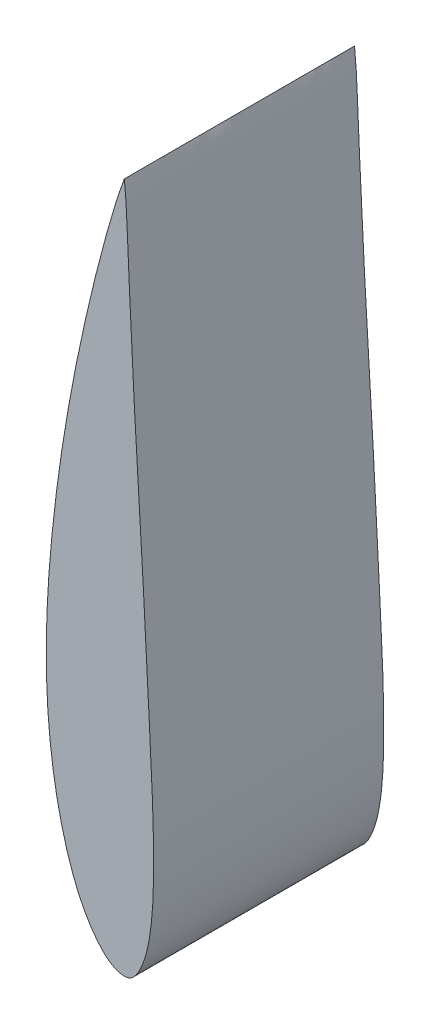
ISO-10303-21;
HEADER;
FILE_DESCRIPTION(('STEP AP214'),'2;1');
FILE_NAME('part.step','',(''),(''),'','','');
FILE_SCHEMA(('AUTOMOTIVE_DESIGN { 1 0 10303 214 1 1 1 1 }'));
ENDSEC;
DATA;
#1=APPLICATION_CONTEXT('core data for automotive mechanical design processes');
#2=APPLICATION_PROTOCOL_DEFINITION('international standard','automotive_design',2000,#1);
#3=PRODUCT_CONTEXT('',#1,'mechanical');
#4=PRODUCT('Part','Part','',(#3));
#5=PRODUCT_RELATED_PRODUCT_CATEGORY('part','',(#4));
#6=PRODUCT_DEFINITION_FORMATION('','',#4);
#7=PRODUCT_DEFINITION_CONTEXT('part definition',#1,'design');
#8=PRODUCT_DEFINITION('design','',#6,#7);
#9=PRODUCT_DEFINITION_SHAPE('','',#8);
#10=(LENGTH_UNIT() NAMED_UNIT(*) SI_UNIT(.MILLI.,.METRE.));
#11=(NAMED_UNIT(*) PLANE_ANGLE_UNIT() SI_UNIT($,.RADIAN.));
#12=(NAMED_UNIT(*) SI_UNIT($,.STERADIAN.) SOLID_ANGLE_UNIT());
#13=UNCERTAINTY_MEASURE_WITH_UNIT(LENGTH_MEASURE(1.E-05),#10,'distance_accuracy_value','');
#14=(GEOMETRIC_REPRESENTATION_CONTEXT(3) GLOBAL_UNCERTAINTY_ASSIGNED_CONTEXT((#13)) GLOBAL_UNIT_ASSIGNED_CONTEXT((#10,
#11,#12)) REPRESENTATION_CONTEXT('',''));
#15=CARTESIAN_POINT('',(0.,0.,0.));
#16=DIRECTION('',(0.,0.,1.));
#17=DIRECTION('',(1.,0.,0.));
#18=AXIS2_PLACEMENT_3D('',#15,#16,#17);
#19=CARTESIAN_POINT('',(15.4663667825706,28.1261565789334,10.));
#20=CARTESIAN_POINT('',(15.4638684441459,28.126783161376,10.));
#21=CARTESIAN_POINT('',(15.4449104835097,28.056380528739,10.));
#22=CARTESIAN_POINT('',(15.4132361228788,27.9869053379319,10.));
#23=CARTESIAN_POINT('',(15.3535076497844,27.8123946326928,10.));
#24=CARTESIAN_POINT('',(15.276656887395,27.5965068689572,10.));
#25=CARTESIAN_POINT('',(15.1798013636871,27.3098248242934,10.));
#26=CARTESIAN_POINT('',(15.0695855777394,26.9653938982621,10.));
#27=CARTESIAN_POINT('',(14.946199643225,26.560433585722,10.));
#28=CARTESIAN_POINT('',(14.8122993513487,26.0981120447139,10.));
#29=CARTESIAN_POINT('',(14.6672927332637,25.5803222969941,10.));
#30=CARTESIAN_POINT('',(14.5122028757606,25.0094076938907,10.));
#31=CARTESIAN_POINT('',(14.3492055748167,24.3875504002957,10.));
#32=CARTESIAN_POINT('',(14.1802364286354,23.7173609394492,10.));
#33=CARTESIAN_POINT('',(14.0072122750729,23.001788509567,10.));
#34=CARTESIAN_POINT('',(13.831126746328,22.2440603500589,10.));
#35=CARTESIAN_POINT('',(13.653483137024,21.4472674881157,10.));
#36=CARTESIAN_POINT('',(13.4761436714645,20.6148114522323,10.));
#37=CARTESIAN_POINT('',(13.3014519360402,19.7502532843641,10.));
#38=CARTESIAN_POINT('',(13.1320910072835,18.8572873539011,10.));
#39=CARTESIAN_POINT('',(12.9690687059906,17.9399020888325,10.));
#40=CARTESIAN_POINT('',(12.8149730888797,17.0018370687674,10.));
#41=CARTESIAN_POINT('',(12.6709210221806,16.0470970432242,10.));
#42=CARTESIAN_POINT('',(12.5385925023225,15.0798469590538,10.));
#43=CARTESIAN_POINT('',(12.4195794601418,14.1041599314178,10.));
#44=CARTESIAN_POINT('',(12.3142372542669,13.1244575194772,10.));
#45=CARTESIAN_POINT('',(12.2252228130272,12.1447047602585,10.));
#46=CARTESIAN_POINT('',(12.1540031226636,11.169046452169,10.));
#47=CARTESIAN_POINT('',(12.1027505288352,10.2017496846331,10.));
#48=CARTESIAN_POINT('',(12.07391949847,9.24688039045705,10.));
#49=CARTESIAN_POINT('',(12.0696314460418,8.30865956392001,10.));
#50=CARTESIAN_POINT('',(12.0898675722181,7.39099241897038,10.));
#51=CARTESIAN_POINT('',(12.1361123412766,6.49780387054982,10.));
#52=CARTESIAN_POINT('',(12.2078304573246,5.63293191508567,10.));
#53=CARTESIAN_POINT('',(12.3038231540884,4.80019076779166,10.));
#54=CARTESIAN_POINT('',(12.4222428024502,4.00314723400594,10.));
#55=CARTESIAN_POINT('',(12.5611743969195,3.24504816059358,10.));
#56=CARTESIAN_POINT('',(12.720678449849,2.52937489258769,10.));
#57=CARTESIAN_POINT('',(12.8969979606794,1.85892032984315,10.));
#58=CARTESIAN_POINT('',(13.0873995095947,1.23623032193105,10.));
#59=CARTESIAN_POINT('',(13.2924820899346,0.663839707621272,10.));
#60=CARTESIAN_POINT('',(13.5145962777507,0.145201492771341,10.));
#61=CARTESIAN_POINT('',(13.7502285166945,-0.317791232952857,10.));
#62=CARTESIAN_POINT('',(13.9948999580407,-0.722358558788239,10.));
#63=CARTESIAN_POINT('',(14.2393122930177,-1.06970969381758,10.));
#64=CARTESIAN_POINT('',(14.4836626029098,-1.35717710638239,10.));
#65=CARTESIAN_POINT('',(14.7285679118952,-1.58656762317428,10.));
#66=CARTESIAN_POINT('',(14.980525239646,-1.74951913248341,10.));
#67=CARTESIAN_POINT('',(15.2275212188089,-1.84689350033204,10.));
#68=CARTESIAN_POINT('',(15.4562135588772,-1.88468261258595,10.));
#69=CARTESIAN_POINT('',(15.6623567957161,-1.85526604765274,10.));
#70=CARTESIAN_POINT('',(15.8352251018268,-1.74610174668397,10.));
#71=CARTESIAN_POINT('',(15.9814071962862,-1.5760168438643,10.));
#72=CARTESIAN_POINT('',(16.1216878299964,-1.35043992293945,10.));
#73=CARTESIAN_POINT('',(16.2511743513379,-1.06244305818338,10.));
#74=CARTESIAN_POINT('',(16.3739456736392,-0.716282449663887,10.));
#75=CARTESIAN_POINT('',(16.4824826632833,-0.310533014423055,10.));
#76=CARTESIAN_POINT('',(16.5705795631837,0.152972685246866,10.));
#77=CARTESIAN_POINT('',(16.6390310000473,0.671569463248005,10.));
#78=CARTESIAN_POINT('',(16.6897680864658,1.24306491215493,10.));
#79=CARTESIAN_POINT('',(16.7226898439998,1.86529194219535,10.));
#80=CARTESIAN_POINT('',(16.7392883331958,2.53565687159472,10.));
#81=CARTESIAN_POINT('',(16.7410673558371,3.25119604126866,10.));
#82=CARTESIAN_POINT('',(16.7312197404145,4.00886684814358,10.));
#83=CARTESIAN_POINT('',(16.7095107605175,4.8055974072795,10.));
#84=CARTESIAN_POINT('',(16.6769565992356,5.63794491301902,10.));
#85=CARTESIAN_POINT('',(16.6371725794661,6.50236821700548,10.));
#86=CARTESIAN_POINT('',(16.5925742603328,7.3950781684484,10.));
#87=CARTESIAN_POINT('',(16.5458464221199,8.31231620396819,10.));
#88=CARTESIAN_POINT('',(16.4981464454011,9.25018564884699,10.));
#89=CARTESIAN_POINT('',(16.4492158269578,10.2047584479837,10.));
#90=CARTESIAN_POINT('',(16.3988386762855,11.1718340743897,10.));
#91=CARTESIAN_POINT('',(16.3465369654988,12.1472975389514,10.));
#92=CARTESIAN_POINT('',(16.2924832004316,13.1268627729053,10.));
#93=CARTESIAN_POINT('',(16.2366026333116,14.1064200102949,10.));
#94=CARTESIAN_POINT('',(16.1790288799891,15.0818521352054,10.));
#95=CARTESIAN_POINT('',(16.1210903795753,16.0489024180898,10.));
#96=CARTESIAN_POINT('',(16.0628590119413,17.0034158526685,10.));
#97=CARTESIAN_POINT('',(16.0060830719895,17.9412284272592,10.));
#98=CARTESIAN_POINT('',(15.9528069565538,18.8585021462133,10.));
#99=CARTESIAN_POINT('',(15.9020685971365,19.7512346116812,10.));
#100=CARTESIAN_POINT('',(15.8556828073345,20.6157167672786,10.));
#101=CARTESIAN_POINT('',(15.8128190484314,21.4480943421943,10.));
#102=CARTESIAN_POINT('',(15.7732662875043,22.2447729157808,10.));
#103=CARTESIAN_POINT('',(15.7368139962213,23.0023562221678,10.));
#104=CARTESIAN_POINT('',(15.7028915917369,23.7177227745752,10.));
#105=CARTESIAN_POINT('',(15.6721054158496,24.3878002824584,10.));
#106=CARTESIAN_POINT('',(15.6443878993426,25.0095846857634,10.));
#107=CARTESIAN_POINT('',(15.6194869296547,25.5804505409505,10.));
#108=CARTESIAN_POINT('',(15.5982599555344,26.0981074842884,10.));
#109=CARTESIAN_POINT('',(15.5780977845238,26.5601358741885,10.));
#110=CARTESIAN_POINT('',(15.5581662630773,26.9650484758902,10.));
#111=CARTESIAN_POINT('',(15.5372333460942,27.3094590215769,10.));
#112=CARTESIAN_POINT('',(15.5159014125044,27.5961842592088,10.));
#113=CARTESIAN_POINT('',(15.4959033626249,27.8127164724872,10.));
#114=CARTESIAN_POINT('',(15.4821943198853,27.9858025111504,10.));
#115=CARTESIAN_POINT('',(15.4701674231533,28.058189593863,10.));
#116=CARTESIAN_POINT('',(15.4687264345746,28.1255647789988,10.));
#117=CARTESIAN_POINT('',(15.4663667825706,28.1261565789334,10.));
#118=B_SPLINE_CURVE_WITH_KNOTS('',3,(#19,#20,#21,#22,#23,#24,#25,#26,#27,#28,#29,#30,#31,#32,
#33,#34,#35,#36,#37,#38,#39,#40,#41,#42,#43,#44,#45,#46,#47,#48,#49,#50,#51,#52,#53,#54,#55,#56,
#57,#58,#59,#60,#61,#62,#63,#64,#65,#66,#67,#68,#69,#70,#71,#72,#73,#74,#75,#76,#77,#78,#79,#80,
#81,#82,#83,#84,#85,#86,#87,#88,#89,#90,#91,#92,#93,#94,#95,#96,#97,#98,#99,#100,#101,#102,#103,
#104,#105,#106,#107,#108,#109,#110,#111,#112,#113,#114,#115,#116,#117),.UNSPECIFIED.,.T.,.F.,(4,
1,1,1,1,1,1,1,1,1,1,1,1,1,1,1,1,1,1,1,1,1,1,1,1,1,1,1,1,1,1,1,1,1,1,1,1,1,1,1,1,1,1,1,1,1,1,1,1,
1,1,1,1,1,1,1,1,1,1,1,1,1,1,1,1,1,1,1,1,1,1,1,1,1,1,1,1,1,1,1,1,1,1,1,1,1,1,1,1,1,1,1,1,1,1,1,
4),(0.,0.000551748168968893,0.00220699267587567,0.00495331783629985,0.00876859672551883,
0.0136237103771036,0.0194917544957016,0.0263313761663127,0.0341182377216171,0.042814763955343,
0.0523803885286978,0.062780118387526,0.0739593343954944,0.085864937864062,0.0984463037826211,
0.111647061015066,0.12541472895254,0.139681018693595,0.154378272357371,0.169446877618796,
0.184821177621069,0.200432900996903,0.216223779700666,0.232116858767118,0.248051215843782,
0.263959620823849,0.27977654948636,0.295442408690199,0.310884918055121,0.326054012337803,
0.340892172022955,0.35534852787555,0.369377925346872,0.382929883149188,0.395952713293497,
0.408409584981713,0.420261404507798,0.431467240770188,0.441987752365542,0.451798802150431,
0.460909689796347,0.469303541319367,0.476945895645793,0.483797690745962,0.489858127722002,
0.495197566311554,0.499996833289608,0.504303705219508,0.507974055932029,0.511122506497602,
0.514149355613405,0.517650443947016,0.52191241533645,0.526982255093721,0.532915788027299,
0.539692296023927,0.547308644858914,0.555757425724944,0.56502508331668,0.575098193409434,
0.585939785327678,0.597509158845338,0.609762380674192,0.622648893896746,0.636121864611897,
0.65011775904116,0.664572179415377,0.679425295742404,0.694613250277113,0.710068303100324,
0.725732642993377,0.741529126657818,0.757394896143958,0.773262272158925,0.789063314563828,
0.804734339670543,0.820197409138394,0.835393047804989,0.85025214178361,0.864711863809534,
0.878713432162598,0.892194296731273,0.905091860230497,0.91735800514861,0.928939747527773,
0.939788482525129,0.949855830913999,0.959093409025121,0.967472191854875,0.974954677217858,
0.981503132690762,0.987099408627994,0.991709920982455,0.995322895771173,0.997916481877858,
0.999478880179029,1.),.UNSPECIFIED.);
#119=DIRECTION('',(0.,0.,-1.));
#120=VECTOR('',#119,1.);
#121=SURFACE_OF_LINEAR_EXTRUSION('',#118,#120);
#122=CARTESIAN_POINT('',(15.4663667825706,28.1261565789334,10.));
#123=VERTEX_POINT('',#122);
#124=EDGE_CURVE('E10',#123,#123,#118,.T.);
#125=ORIENTED_EDGE('',*,*,#124,.F.);
#126=EDGE_LOOP('',(#125));
#127=FACE_BOUND('',#126,.T.);
#128=CARTESIAN_POINT('',(15.4663667825706,28.1261565789334,0.));
#129=CARTESIAN_POINT('',(15.4638684441459,28.126783161376,0.));
#130=CARTESIAN_POINT('',(15.4449104835097,28.056380528739,0.));
#131=CARTESIAN_POINT('',(15.4132361228788,27.9869053379319,0.));
#132=CARTESIAN_POINT('',(15.3535076497844,27.8123946326928,0.));
#133=CARTESIAN_POINT('',(15.276656887395,27.5965068689572,0.));
#134=CARTESIAN_POINT('',(15.1798013636871,27.3098248242934,0.));
#135=CARTESIAN_POINT('',(15.0695855777394,26.9653938982621,0.));
#136=CARTESIAN_POINT('',(14.946199643225,26.560433585722,0.));
#137=CARTESIAN_POINT('',(14.8122993513487,26.0981120447139,0.));
#138=CARTESIAN_POINT('',(14.6672927332637,25.5803222969941,0.));
#139=CARTESIAN_POINT('',(14.5122028757606,25.0094076938907,0.));
#140=CARTESIAN_POINT('',(14.3492055748167,24.3875504002957,0.));
#141=CARTESIAN_POINT('',(14.1802364286354,23.7173609394492,0.));
#142=CARTESIAN_POINT('',(14.0072122750729,23.001788509567,0.));
#143=CARTESIAN_POINT('',(13.831126746328,22.2440603500589,0.));
#144=CARTESIAN_POINT('',(13.653483137024,21.4472674881157,0.));
#145=CARTESIAN_POINT('',(13.4761436714645,20.6148114522323,0.));
#146=CARTESIAN_POINT('',(13.3014519360402,19.7502532843641,0.));
#147=CARTESIAN_POINT('',(13.1320910072835,18.8572873539011,0.));
#148=CARTESIAN_POINT('',(12.9690687059906,17.9399020888325,0.));
#149=CARTESIAN_POINT('',(12.8149730888797,17.0018370687674,0.));
#150=CARTESIAN_POINT('',(12.6709210221806,16.0470970432242,0.));
#151=CARTESIAN_POINT('',(12.5385925023225,15.0798469590538,0.));
#152=CARTESIAN_POINT('',(12.4195794601418,14.1041599314178,0.));
#153=CARTESIAN_POINT('',(12.3142372542669,13.1244575194772,0.));
#154=CARTESIAN_POINT('',(12.2252228130272,12.1447047602585,0.));
#155=CARTESIAN_POINT('',(12.1540031226636,11.169046452169,0.));
#156=CARTESIAN_POINT('',(12.1027505288352,10.2017496846331,0.));
#157=CARTESIAN_POINT('',(12.07391949847,9.24688039045705,0.));
#158=CARTESIAN_POINT('',(12.0696314460418,8.30865956392001,0.));
#159=CARTESIAN_POINT('',(12.0898675722181,7.39099241897038,0.));
#160=CARTESIAN_POINT('',(12.1361123412766,6.49780387054982,0.));
#161=CARTESIAN_POINT('',(12.2078304573246,5.63293191508567,0.));
#162=CARTESIAN_POINT('',(12.3038231540884,4.80019076779166,0.));
#163=CARTESIAN_POINT('',(12.4222428024502,4.00314723400594,0.));
#164=CARTESIAN_POINT('',(12.5611743969195,3.24504816059358,0.));
#165=CARTESIAN_POINT('',(12.720678449849,2.52937489258769,0.));
#166=CARTESIAN_POINT('',(12.8969979606794,1.85892032984315,0.));
#167=CARTESIAN_POINT('',(13.0873995095947,1.23623032193105,0.));
#168=CARTESIAN_POINT('',(13.2924820899346,0.663839707621272,0.));
#169=CARTESIAN_POINT('',(13.5145962777507,0.145201492771341,0.));
#170=CARTESIAN_POINT('',(13.7502285166945,-0.317791232952857,0.));
#171=CARTESIAN_POINT('',(13.9948999580407,-0.722358558788239,0.));
#172=CARTESIAN_POINT('',(14.2393122930177,-1.06970969381758,0.));
#173=CARTESIAN_POINT('',(14.4836626029098,-1.35717710638239,0.));
#174=CARTESIAN_POINT('',(14.7285679118952,-1.58656762317428,0.));
#175=CARTESIAN_POINT('',(14.980525239646,-1.74951913248341,0.));
#176=CARTESIAN_POINT('',(15.2275212188089,-1.84689350033204,0.));
#177=CARTESIAN_POINT('',(15.4562135588772,-1.88468261258595,0.));
#178=CARTESIAN_POINT('',(15.6623567957161,-1.85526604765274,0.));
#179=CARTESIAN_POINT('',(15.8352251018268,-1.74610174668397,0.));
#180=CARTESIAN_POINT('',(15.9814071962862,-1.5760168438643,0.));
#181=CARTESIAN_POINT('',(16.1216878299964,-1.35043992293945,0.));
#182=CARTESIAN_POINT('',(16.2511743513379,-1.06244305818338,0.));
#183=CARTESIAN_POINT('',(16.3739456736392,-0.716282449663887,0.));
#184=CARTESIAN_POINT('',(16.4824826632833,-0.310533014423055,0.));
#185=CARTESIAN_POINT('',(16.5705795631837,0.152972685246866,0.));
#186=CARTESIAN_POINT('',(16.6390310000473,0.671569463248005,0.));
#187=CARTESIAN_POINT('',(16.6897680864658,1.24306491215493,0.));
#188=CARTESIAN_POINT('',(16.7226898439998,1.86529194219535,0.));
#189=CARTESIAN_POINT('',(16.7392883331958,2.53565687159472,0.));
#190=CARTESIAN_POINT('',(16.7410673558371,3.25119604126866,0.));
#191=CARTESIAN_POINT('',(16.7312197404145,4.00886684814358,0.));
#192=CARTESIAN_POINT('',(16.7095107605175,4.8055974072795,0.));
#193=CARTESIAN_POINT('',(16.6769565992356,5.63794491301902,0.));
#194=CARTESIAN_POINT('',(16.6371725794661,6.50236821700548,0.));
#195=CARTESIAN_POINT('',(16.5925742603328,7.3950781684484,0.));
#196=CARTESIAN_POINT('',(16.5458464221199,8.31231620396819,0.));
#197=CARTESIAN_POINT('',(16.4981464454011,9.25018564884699,0.));
#198=CARTESIAN_POINT('',(16.4492158269578,10.2047584479837,0.));
#199=CARTESIAN_POINT('',(16.3988386762855,11.1718340743897,0.));
#200=CARTESIAN_POINT('',(16.3465369654988,12.1472975389514,0.));
#201=CARTESIAN_POINT('',(16.2924832004316,13.1268627729053,0.));
#202=CARTESIAN_POINT('',(16.2366026333116,14.1064200102949,0.));
#203=CARTESIAN_POINT('',(16.1790288799891,15.0818521352054,0.));
#204=CARTESIAN_POINT('',(16.1210903795753,16.0489024180898,0.));
#205=CARTESIAN_POINT('',(16.0628590119413,17.0034158526685,0.));
#206=CARTESIAN_POINT('',(16.0060830719895,17.9412284272592,0.));
#207=CARTESIAN_POINT('',(15.9528069565538,18.8585021462133,0.));
#208=CARTESIAN_POINT('',(15.9020685971365,19.7512346116812,0.));
#209=CARTESIAN_POINT('',(15.8556828073345,20.6157167672786,0.));
#210=CARTESIAN_POINT('',(15.8128190484314,21.4480943421943,0.));
#211=CARTESIAN_POINT('',(15.7732662875043,22.2447729157808,0.));
#212=CARTESIAN_POINT('',(15.7368139962213,23.0023562221678,0.));
#213=CARTESIAN_POINT('',(15.7028915917369,23.7177227745752,0.));
#214=CARTESIAN_POINT('',(15.6721054158496,24.3878002824584,0.));
#215=CARTESIAN_POINT('',(15.6443878993426,25.0095846857634,0.));
#216=CARTESIAN_POINT('',(15.6194869296547,25.5804505409505,0.));
#217=CARTESIAN_POINT('',(15.5982599555344,26.0981074842884,0.));
#218=CARTESIAN_POINT('',(15.5780977845238,26.5601358741885,0.));
#219=CARTESIAN_POINT('',(15.5581662630773,26.9650484758902,0.));
#220=CARTESIAN_POINT('',(15.5372333460942,27.3094590215769,0.));
#221=CARTESIAN_POINT('',(15.5159014125044,27.5961842592088,0.));
#222=CARTESIAN_POINT('',(15.4959033626249,27.8127164724872,0.));
#223=CARTESIAN_POINT('',(15.4821943198853,27.9858025111504,0.));
#224=CARTESIAN_POINT('',(15.4701674231533,28.058189593863,0.));
#225=CARTESIAN_POINT('',(15.4687264345746,28.1255647789988,0.));
#226=CARTESIAN_POINT('',(15.4663667825706,28.1261565789334,0.));
#227=B_SPLINE_CURVE_WITH_KNOTS('',3,(#128,#129,#130,#131,#132,#133,#134,#135,#136,#137,#138,
#139,#140,#141,#142,#143,#144,#145,#146,#147,#148,#149,#150,#151,#152,#153,#154,#155,#156,#157,
#158,#159,#160,#161,#162,#163,#164,#165,#166,#167,#168,#169,#170,#171,#172,#173,#174,#175,#176,
#177,#178,#179,#180,#181,#182,#183,#184,#185,#186,#187,#188,#189,#190,#191,#192,#193,#194,#195,
#196,#197,#198,#199,#200,#201,#202,#203,#204,#205,#206,#207,#208,#209,#210,#211,#212,#213,#214,
#215,#216,#217,#218,#219,#220,#221,#222,#223,#224,#225,#226),.UNSPECIFIED.,.T.,.F.,(4,1,1,1,1,1,
1,1,1,1,1,1,1,1,1,1,1,1,1,1,1,1,1,1,1,1,1,1,1,1,1,1,1,1,1,1,1,1,1,1,1,1,1,1,1,1,1,1,1,1,1,1,1,1,
1,1,1,1,1,1,1,1,1,1,1,1,1,1,1,1,1,1,1,1,1,1,1,1,1,1,1,1,1,1,1,1,1,1,1,1,1,1,1,1,1,1,4),(0.,
0.000551748168968893,0.00220699267587567,0.00495331783629985,0.00876859672551883,
0.0136237103771036,0.0194917544957016,0.0263313761663127,0.0341182377216171,0.042814763955343,
0.0523803885286978,0.062780118387526,0.0739593343954944,0.085864937864062,0.0984463037826211,
0.111647061015066,0.12541472895254,0.139681018693595,0.154378272357371,0.169446877618796,
0.184821177621069,0.200432900996903,0.216223779700666,0.232116858767118,0.248051215843782,
0.263959620823849,0.27977654948636,0.295442408690199,0.310884918055121,0.326054012337803,
0.340892172022955,0.35534852787555,0.369377925346872,0.382929883149188,0.395952713293497,
0.408409584981713,0.420261404507798,0.431467240770188,0.441987752365542,0.451798802150431,
0.460909689796347,0.469303541319367,0.476945895645793,0.483797690745962,0.489858127722002,
0.495197566311554,0.499996833289608,0.504303705219508,0.507974055932029,0.511122506497602,
0.514149355613405,0.517650443947016,0.52191241533645,0.526982255093721,0.532915788027299,
0.539692296023927,0.547308644858914,0.555757425724944,0.56502508331668,0.575098193409434,
0.585939785327678,0.597509158845338,0.609762380674192,0.622648893896746,0.636121864611897,
0.65011775904116,0.664572179415377,0.679425295742404,0.694613250277113,0.710068303100324,
0.725732642993377,0.741529126657818,0.757394896143958,0.773262272158925,0.789063314563828,
0.804734339670543,0.820197409138394,0.835393047804989,0.85025214178361,0.864711863809534,
0.878713432162598,0.892194296731273,0.905091860230497,0.91735800514861,0.928939747527773,
0.939788482525129,0.949855830913999,0.959093409025121,0.967472191854875,0.974954677217858,
0.981503132690762,0.987099408627994,0.991709920982455,0.995322895771173,0.997916481877858,
0.999478880179029,1.),.UNSPECIFIED.);
#228=CARTESIAN_POINT('',(15.4663667825706,28.1261565789334,0.));
#229=VERTEX_POINT('',#228);
#230=EDGE_CURVE('E41',#229,#229,#227,.T.);
#231=ORIENTED_EDGE('',*,*,#230,.T.);
#232=EDGE_LOOP('',(#231));
#233=FACE_BOUND('',#232,.T.);
#234=ADVANCED_FACE('F37',(#127,#233),#121,.F.);
#235=CARTESIAN_POINT('',(14.9940698265672,-1.74590732623043,10.));
#236=DIRECTION('',(0.,0.,-1.));
#237=DIRECTION('',(-1.,0.,0.));
#238=AXIS2_PLACEMENT_3D('',#235,#236,#237);
#239=PLANE('',#238);
#240=ORIENTED_EDGE('',*,*,#124,.T.);
#241=EDGE_LOOP('',(#240));
#242=FACE_BOUND('',#241,.T.);
#243=ADVANCED_FACE('F60',(#242),#239,.F.);
#244=CARTESIAN_POINT('',(14.9940698265672,-1.74590732623043,0.));
#245=DIRECTION('',(0.,0.,-1.));
#246=DIRECTION('',(-1.,0.,0.));
#247=AXIS2_PLACEMENT_3D('',#244,#245,#246);
#248=PLANE('',#247);
#249=ORIENTED_EDGE('',*,*,#230,.F.);
#250=EDGE_LOOP('',(#249));
#251=FACE_BOUND('',#250,.T.);
#252=ADVANCED_FACE('F58',(#251),#248,.T.);
#253=CLOSED_SHELL('',(#234,#243,#252));
#254=MANIFOLD_SOLID_BREP('B2',#253);
#255=ADVANCED_BREP_SHAPE_REPRESENTATION('',(#18,#254),#14);
#256=SHAPE_DEFINITION_REPRESENTATION(#9,#255);
ENDSEC;
END-ISO-10303-21;
